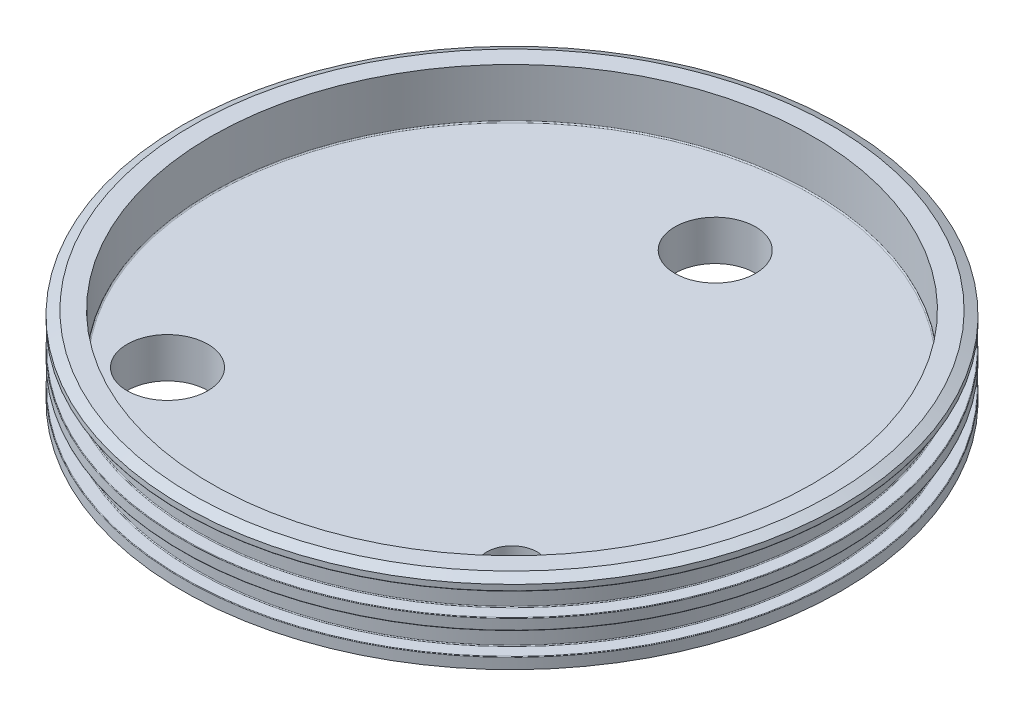
ISO-10303-21;
HEADER;
FILE_DESCRIPTION(('STEP AP214'),'2;1');
FILE_NAME('part.step','',(''),(''),'','','');
FILE_SCHEMA(('AUTOMOTIVE_DESIGN { 1 0 10303 214 1 1 1 1 }'));
ENDSEC;
DATA;
#1=APPLICATION_CONTEXT('core data for automotive mechanical design processes');
#2=APPLICATION_PROTOCOL_DEFINITION('international standard','automotive_design',2000,#1);
#3=PRODUCT_CONTEXT('',#1,'mechanical');
#4=PRODUCT('Part','Part','',(#3));
#5=PRODUCT_RELATED_PRODUCT_CATEGORY('part','',(#4));
#6=PRODUCT_DEFINITION_FORMATION('','',#4);
#7=PRODUCT_DEFINITION_CONTEXT('part definition',#1,'design');
#8=PRODUCT_DEFINITION('design','',#6,#7);
#9=PRODUCT_DEFINITION_SHAPE('','',#8);
#10=(LENGTH_UNIT() NAMED_UNIT(*) SI_UNIT(.MILLI.,.METRE.));
#11=(NAMED_UNIT(*) PLANE_ANGLE_UNIT() SI_UNIT($,.RADIAN.));
#12=(NAMED_UNIT(*) SI_UNIT($,.STERADIAN.) SOLID_ANGLE_UNIT());
#13=UNCERTAINTY_MEASURE_WITH_UNIT(LENGTH_MEASURE(1.E-05),#10,'distance_accuracy_value','');
#14=(GEOMETRIC_REPRESENTATION_CONTEXT(3) GLOBAL_UNCERTAINTY_ASSIGNED_CONTEXT((#13)) GLOBAL_UNIT_ASSIGNED_CONTEXT((#10,
#11,#12)) REPRESENTATION_CONTEXT('',''));
#15=CARTESIAN_POINT('',(0.,0.,0.));
#16=DIRECTION('',(0.,0.,1.));
#17=DIRECTION('',(1.,0.,0.));
#18=AXIS2_PLACEMENT_3D('',#15,#16,#17);
#19=CARTESIAN_POINT('',(0.,0.,0.));
#20=DIRECTION('',(0.,1.,0.));
#21=DIRECTION('',(-1.,0.,0.));
#22=AXIS2_PLACEMENT_3D('',#19,#20,#21);
#23=PLANE('',#22);
#24=CARTESIAN_POINT('',(0.,0.,0.));
#25=DIRECTION('',(0.,1.,0.));
#26=DIRECTION('',(-1.,0.,0.));
#27=AXIS2_PLACEMENT_3D('',#24,#25,#26);
#28=CIRCLE('',#27,66.2178);
#29=CARTESIAN_POINT('',(-66.2178,0.,0.));
#30=VERTEX_POINT('',#29);
#31=EDGE_CURVE('E92',#30,#30,#28,.T.);
#32=ORIENTED_EDGE('',*,*,#31,.T.);
#33=EDGE_LOOP('',(#32));
#34=FACE_BOUND('',#33,.T.);
#35=CARTESIAN_POINT('',(0.,0.,0.));
#36=DIRECTION('',(0.,1.,0.));
#37=DIRECTION('',(-1.,0.,0.));
#38=AXIS2_PLACEMENT_3D('',#35,#36,#37);
#39=CIRCLE('',#38,72.898);
#40=CARTESIAN_POINT('',(-72.898,0.,0.));
#41=VERTEX_POINT('',#40);
#42=EDGE_CURVE('E73',#41,#41,#39,.T.);
#43=ORIENTED_EDGE('',*,*,#42,.F.);
#44=EDGE_LOOP('',(#43));
#45=FACE_BOUND('',#44,.T.);
#46=ADVANCED_FACE('F45',(#34,#45),#23,.F.);
#47=CARTESIAN_POINT('',(0.,48.1922132313012,0.));
#48=DIRECTION('',(0.,1.,0.));
#49=DIRECTION('',(-1.,0.,0.));
#50=AXIS2_PLACEMENT_3D('',#47,#48,#49);
#51=CYLINDRICAL_SURFACE('',#50,72.898);
#52=CARTESIAN_POINT('',(0.,2.33679999999999,0.));
#53=DIRECTION('',(0.,-1.,0.));
#54=DIRECTION('',(1.,0.,0.));
#55=AXIS2_PLACEMENT_3D('',#52,#53,#54);
#56=CIRCLE('',#55,72.898);
#57=CARTESIAN_POINT('',(72.898,2.3368,0.));
#58=VERTEX_POINT('',#57);
#59=EDGE_CURVE('E164',#58,#58,#56,.T.);
#60=ORIENTED_EDGE('',*,*,#59,.T.);
#61=EDGE_LOOP('',(#60));
#62=FACE_BOUND('',#61,.T.);
#63=ORIENTED_EDGE('',*,*,#42,.T.);
#64=EDGE_LOOP('',(#63));
#65=FACE_BOUND('',#64,.T.);
#66=ADVANCED_FACE('F202',(#62,#65),#51,.T.);
#67=CARTESIAN_POINT('',(72.898,2.4638,0.));
#68=DIRECTION('',(0.,-1.,0.));
#69=DIRECTION('',(1.,0.,0.));
#70=AXIS2_PLACEMENT_3D('',#67,#68,#69);
#71=PLANE('',#70);
#72=CARTESIAN_POINT('',(0.,2.46379999999999,0.));
#73=DIRECTION('',(0.,-1.,0.));
#74=DIRECTION('',(1.,0.,0.));
#75=AXIS2_PLACEMENT_3D('',#72,#73,#74);
#76=CIRCLE('',#75,72.771);
#77=CARTESIAN_POINT('',(72.771,2.4638,0.));
#78=VERTEX_POINT('',#77);
#79=EDGE_CURVE('E160',#78,#78,#76,.F.);
#80=ORIENTED_EDGE('',*,*,#79,.T.);
#81=EDGE_LOOP('',(#80));
#82=FACE_BOUND('',#81,.T.);
#83=CARTESIAN_POINT('',(0.,2.46379999999999,0.));
#84=DIRECTION('',(0.,-1.,0.));
#85=DIRECTION('',(1.,0.,0.));
#86=AXIS2_PLACEMENT_3D('',#83,#84,#85);
#87=CIRCLE('',#86,70.1548);
#88=CARTESIAN_POINT('',(70.1548,2.4638,0.));
#89=VERTEX_POINT('',#88);
#90=EDGE_CURVE('E124',#89,#89,#87,.T.);
#91=ORIENTED_EDGE('',*,*,#90,.T.);
#92=EDGE_LOOP('',(#91));
#93=FACE_BOUND('',#92,.T.);
#94=ADVANCED_FACE('F209',(#82,#93),#71,.F.);
#95=CARTESIAN_POINT('',(0.,48.1922132313012,0.));
#96=DIRECTION('',(0.,1.,0.));
#97=DIRECTION('',(-1.,0.,0.));
#98=AXIS2_PLACEMENT_3D('',#95,#96,#97);
#99=CYLINDRICAL_SURFACE('',#98,69.977);
#100=CARTESIAN_POINT('',(0.,7.26439999999999,0.));
#101=DIRECTION('',(0.,1.,0.));
#102=DIRECTION('',(-1.,0.,0.));
#103=AXIS2_PLACEMENT_3D('',#100,#101,#102);
#104=CIRCLE('',#103,69.977);
#105=CARTESIAN_POINT('',(-69.977,7.26439999999998,0.));
#106=VERTEX_POINT('',#105);
#107=EDGE_CURVE('E120',#106,#106,#104,.F.);
#108=ORIENTED_EDGE('',*,*,#107,.T.);
#109=EDGE_LOOP('',(#108));
#110=FACE_BOUND('',#109,.T.);
#111=CARTESIAN_POINT('',(0.,2.64159999999999,0.));
#112=DIRECTION('',(0.,-1.,0.));
#113=DIRECTION('',(1.,0.,0.));
#114=AXIS2_PLACEMENT_3D('',#111,#112,#113);
#115=CIRCLE('',#114,69.977);
#116=CARTESIAN_POINT('',(69.977,2.6416,0.));
#117=VERTEX_POINT('',#116);
#118=EDGE_CURVE('E116',#117,#117,#115,.F.);
#119=ORIENTED_EDGE('',*,*,#118,.T.);
#120=EDGE_LOOP('',(#119));
#121=FACE_BOUND('',#120,.T.);
#122=ADVANCED_FACE('F266',(#110,#121),#99,.T.);
#123=CARTESIAN_POINT('',(69.977,7.4422,0.));
#124=DIRECTION('',(0.,1.,0.));
#125=DIRECTION('',(-1.,0.,0.));
#126=AXIS2_PLACEMENT_3D('',#123,#124,#125);
#127=PLANE('',#126);
#128=CARTESIAN_POINT('',(0.,7.44219999999999,0.));
#129=DIRECTION('',(0.,1.,0.));
#130=DIRECTION('',(-1.,0.,0.));
#131=AXIS2_PLACEMENT_3D('',#128,#129,#130);
#132=CIRCLE('',#131,72.771);
#133=CARTESIAN_POINT('',(-72.771,7.44219999999998,0.));
#134=VERTEX_POINT('',#133);
#135=EDGE_CURVE('E156',#134,#134,#132,.F.);
#136=ORIENTED_EDGE('',*,*,#135,.T.);
#137=EDGE_LOOP('',(#136));
#138=FACE_BOUND('',#137,.T.);
#139=CARTESIAN_POINT('',(0.,7.44219999999999,0.));
#140=DIRECTION('',(0.,1.,0.));
#141=DIRECTION('',(-1.,0.,0.));
#142=AXIS2_PLACEMENT_3D('',#139,#140,#141);
#143=CIRCLE('',#142,70.1548);
#144=CARTESIAN_POINT('',(-70.1548,7.44219999999998,0.));
#145=VERTEX_POINT('',#144);
#146=EDGE_CURVE('E112',#145,#145,#143,.T.);
#147=ORIENTED_EDGE('',*,*,#146,.T.);
#148=EDGE_LOOP('',(#147));
#149=FACE_BOUND('',#148,.T.);
#150=ADVANCED_FACE('F271',(#138,#149),#127,.F.);
#151=CARTESIAN_POINT('',(0.,48.1922132313012,0.));
#152=DIRECTION('',(0.,1.,0.));
#153=DIRECTION('',(-1.,0.,0.));
#154=AXIS2_PLACEMENT_3D('',#151,#152,#153);
#155=CYLINDRICAL_SURFACE('',#154,72.898);
#156=CARTESIAN_POINT('',(0.,9.77899999999999,0.));
#157=DIRECTION('',(0.,-1.,0.));
#158=DIRECTION('',(1.,0.,0.));
#159=AXIS2_PLACEMENT_3D('',#156,#157,#158);
#160=CIRCLE('',#159,72.898);
#161=CARTESIAN_POINT('',(72.898,9.779,0.));
#162=VERTEX_POINT('',#161);
#163=EDGE_CURVE('E136',#162,#162,#160,.T.);
#164=ORIENTED_EDGE('',*,*,#163,.T.);
#165=EDGE_LOOP('',(#164));
#166=FACE_BOUND('',#165,.T.);
#167=CARTESIAN_POINT('',(0.,7.56919999999999,0.));
#168=DIRECTION('',(0.,1.,0.));
#169=DIRECTION('',(-1.,0.,0.));
#170=AXIS2_PLACEMENT_3D('',#167,#168,#169);
#171=CIRCLE('',#170,72.898);
#172=CARTESIAN_POINT('',(-72.898,7.56919999999998,0.));
#173=VERTEX_POINT('',#172);
#174=EDGE_CURVE('E132',#173,#173,#171,.T.);
#175=ORIENTED_EDGE('',*,*,#174,.T.);
#176=EDGE_LOOP('',(#175));
#177=FACE_BOUND('',#176,.T.);
#178=ADVANCED_FACE('F278',(#166,#177),#155,.T.);
#179=CARTESIAN_POINT('',(72.898,9.906,0.));
#180=DIRECTION('',(0.,-1.,0.));
#181=DIRECTION('',(1.,0.,0.));
#182=AXIS2_PLACEMENT_3D('',#179,#180,#181);
#183=PLANE('',#182);
#184=CARTESIAN_POINT('',(0.,9.90599999999999,0.));
#185=DIRECTION('',(0.,-1.,0.));
#186=DIRECTION('',(1.,0.,0.));
#187=AXIS2_PLACEMENT_3D('',#184,#185,#186);
#188=CIRCLE('',#187,72.771);
#189=CARTESIAN_POINT('',(72.771,9.906,0.));
#190=VERTEX_POINT('',#189);
#191=EDGE_CURVE('E128',#190,#190,#188,.F.);
#192=ORIENTED_EDGE('',*,*,#191,.T.);
#193=EDGE_LOOP('',(#192));
#194=FACE_BOUND('',#193,.T.);
#195=CARTESIAN_POINT('',(0.,9.90599999999999,0.));
#196=DIRECTION('',(0.,-1.,0.));
#197=DIRECTION('',(1.,0.,0.));
#198=AXIS2_PLACEMENT_3D('',#195,#196,#197);
#199=CIRCLE('',#198,70.1548);
#200=CARTESIAN_POINT('',(70.1548,9.906,0.));
#201=VERTEX_POINT('',#200);
#202=EDGE_CURVE('E108',#201,#201,#199,.T.);
#203=ORIENTED_EDGE('',*,*,#202,.T.);
#204=EDGE_LOOP('',(#203));
#205=FACE_BOUND('',#204,.T.);
#206=ADVANCED_FACE('F284',(#194,#205),#183,.F.);
#207=CARTESIAN_POINT('',(0.,48.1922132313012,0.));
#208=DIRECTION('',(0.,1.,0.));
#209=DIRECTION('',(-1.,0.,0.));
#210=AXIS2_PLACEMENT_3D('',#207,#208,#209);
#211=CYLINDRICAL_SURFACE('',#210,69.977);
#212=CARTESIAN_POINT('',(0.,14.8082,0.));
#213=DIRECTION('',(0.,1.,0.));
#214=DIRECTION('',(-1.,0.,0.));
#215=AXIS2_PLACEMENT_3D('',#212,#213,#214);
#216=CIRCLE('',#215,69.977);
#217=CARTESIAN_POINT('',(-69.977,14.8082,0.));
#218=VERTEX_POINT('',#217);
#219=EDGE_CURVE('E104',#218,#218,#216,.F.);
#220=ORIENTED_EDGE('',*,*,#219,.T.);
#221=EDGE_LOOP('',(#220));
#222=FACE_BOUND('',#221,.T.);
#223=CARTESIAN_POINT('',(0.,10.0838,0.));
#224=DIRECTION('',(0.,-1.,0.));
#225=DIRECTION('',(1.,0.,0.));
#226=AXIS2_PLACEMENT_3D('',#223,#224,#225);
#227=CIRCLE('',#226,69.977);
#228=CARTESIAN_POINT('',(69.977,10.0838,0.));
#229=VERTEX_POINT('',#228);
#230=EDGE_CURVE('E100',#229,#229,#227,.F.);
#231=ORIENTED_EDGE('',*,*,#230,.T.);
#232=EDGE_LOOP('',(#231));
#233=FACE_BOUND('',#232,.T.);
#234=ADVANCED_FACE('F288',(#222,#233),#211,.T.);
#235=CARTESIAN_POINT('',(69.977,14.986,0.));
#236=DIRECTION('',(0.,1.,0.));
#237=DIRECTION('',(-1.,0.,0.));
#238=AXIS2_PLACEMENT_3D('',#235,#236,#237);
#239=PLANE('',#238);
#240=CARTESIAN_POINT('',(0.,14.986,0.));
#241=DIRECTION('',(0.,1.,0.));
#242=DIRECTION('',(-1.,0.,0.));
#243=AXIS2_PLACEMENT_3D('',#240,#241,#242);
#244=CIRCLE('',#243,72.771);
#245=CARTESIAN_POINT('',(-72.771,14.986,0.));
#246=VERTEX_POINT('',#245);
#247=EDGE_CURVE('E144',#246,#246,#244,.F.);
#248=ORIENTED_EDGE('',*,*,#247,.T.);
#249=EDGE_LOOP('',(#248));
#250=FACE_BOUND('',#249,.T.);
#251=CARTESIAN_POINT('',(0.,14.986,0.));
#252=DIRECTION('',(0.,1.,0.));
#253=DIRECTION('',(-1.,0.,0.));
#254=AXIS2_PLACEMENT_3D('',#251,#252,#253);
#255=CIRCLE('',#254,70.1548);
#256=CARTESIAN_POINT('',(-70.1548,14.986,0.));
#257=VERTEX_POINT('',#256);
#258=EDGE_CURVE('E96',#257,#257,#255,.T.);
#259=ORIENTED_EDGE('',*,*,#258,.T.);
#260=EDGE_LOOP('',(#259));
#261=FACE_BOUND('',#260,.T.);
#262=ADVANCED_FACE('F291',(#250,#261),#239,.F.);
#263=CARTESIAN_POINT('',(0.,48.1922132313012,0.));
#264=DIRECTION('',(0.,1.,0.));
#265=DIRECTION('',(-1.,0.,0.));
#266=AXIS2_PLACEMENT_3D('',#263,#264,#265);
#267=CYLINDRICAL_SURFACE('',#266,72.898);
#268=CARTESIAN_POINT('',(0.,16.3322,0.));
#269=DIRECTION('',(0.,-1.,0.));
#270=DIRECTION('',(1.,0.,0.));
#271=AXIS2_PLACEMENT_3D('',#268,#269,#270);
#272=CIRCLE('',#271,72.898);
#273=CARTESIAN_POINT('',(72.898,16.3322,0.));
#274=VERTEX_POINT('',#273);
#275=EDGE_CURVE('E60',#274,#274,#272,.T.);
#276=ORIENTED_EDGE('',*,*,#275,.T.);
#277=EDGE_LOOP('',(#276));
#278=FACE_BOUND('',#277,.T.);
#279=CARTESIAN_POINT('',(0.,15.113,0.));
#280=DIRECTION('',(0.,1.,0.));
#281=DIRECTION('',(-1.,0.,0.));
#282=AXIS2_PLACEMENT_3D('',#279,#280,#281);
#283=CIRCLE('',#282,72.898);
#284=CARTESIAN_POINT('',(-72.898,15.113,0.));
#285=VERTEX_POINT('',#284);
#286=EDGE_CURVE('E140',#285,#285,#283,.T.);
#287=ORIENTED_EDGE('',*,*,#286,.T.);
#288=EDGE_LOOP('',(#287));
#289=FACE_BOUND('',#288,.T.);
#290=ADVANCED_FACE('F175',(#278,#289),#267,.T.);
#291=CARTESIAN_POINT('',(72.898,17.3482,0.));
#292=DIRECTION('',(0.,-1.,0.));
#293=DIRECTION('',(1.,0.,0.));
#294=AXIS2_PLACEMENT_3D('',#291,#292,#293);
#295=PLANE('',#294);
#296=CARTESIAN_POINT('',(0.,17.3482,0.));
#297=DIRECTION('',(0.,-1.,0.));
#298=DIRECTION('',(1.,0.,0.));
#299=AXIS2_PLACEMENT_3D('',#296,#297,#298);
#300=CIRCLE('',#299,70.7191809687623);
#301=CARTESIAN_POINT('',(70.7191809687623,17.3482,0.));
#302=VERTEX_POINT('',#301);
#303=EDGE_CURVE('E168',#302,#302,#300,.F.);
#304=ORIENTED_EDGE('',*,*,#303,.T.);
#305=EDGE_LOOP('',(#304));
#306=FACE_BOUND('',#305,.T.);
#307=CARTESIAN_POINT('',(0.,17.3482,0.));
#308=DIRECTION('',(0.,1.,0.));
#309=DIRECTION('',(-1.,0.,0.));
#310=AXIS2_PLACEMENT_3D('',#307,#308,#309);
#311=CIRCLE('',#310,66.548);
#312=CARTESIAN_POINT('',(-66.548,17.3482,0.));
#313=VERTEX_POINT('',#312);
#314=EDGE_CURVE('E66',#313,#313,#311,.T.);
#315=ORIENTED_EDGE('',*,*,#314,.F.);
#316=EDGE_LOOP('',(#315));
#317=FACE_BOUND('',#316,.T.);
#318=ADVANCED_FACE('F184',(#306,#317),#295,.F.);
#319=CARTESIAN_POINT('',(0.,48.1922132313012,0.));
#320=DIRECTION('',(0.,1.,0.));
#321=DIRECTION('',(-1.,0.,0.));
#322=AXIS2_PLACEMENT_3D('',#319,#320,#321);
#323=CYLINDRICAL_SURFACE('',#322,66.548);
#324=CARTESIAN_POINT('',(0.,6.604,0.));
#325=DIRECTION('',(0.,-1.,0.));
#326=DIRECTION('',(1.,0.,0.));
#327=AXIS2_PLACEMENT_3D('',#324,#325,#326);
#328=CIRCLE('',#327,66.548);
#329=CARTESIAN_POINT('',(66.548,6.60400000000001,0.));
#330=VERTEX_POINT('',#329);
#331=EDGE_CURVE('E10',#330,#330,#328,.T.);
#332=ORIENTED_EDGE('',*,*,#331,.T.);
#333=EDGE_LOOP('',(#332));
#334=FACE_BOUND('',#333,.T.);
#335=ORIENTED_EDGE('',*,*,#314,.T.);
#336=EDGE_LOOP('',(#335));
#337=FACE_BOUND('',#336,.T.);
#338=ADVANCED_FACE('F187',(#334,#337),#323,.F.);
#339=CARTESIAN_POINT('',(66.548,6.35,0.));
#340=DIRECTION('',(0.,-1.,0.));
#341=DIRECTION('',(1.,0.,0.));
#342=AXIS2_PLACEMENT_3D('',#339,#340,#341);
#343=PLANE('',#342);
#344=CARTESIAN_POINT('',(-38.1,6.34999999999999,38.1));
#345=DIRECTION('',(0.,-1.,0.));
#346=DIRECTION('',(1.,0.,0.));
#347=AXIS2_PLACEMENT_3D('',#344,#345,#346);
#348=CIRCLE('',#347,8.9281);
#349=CARTESIAN_POINT('',(-29.1719,6.34999999999999,38.1));
#350=VERTEX_POINT('',#349);
#351=EDGE_CURVE('E501',#350,#350,#348,.T.);
#352=ORIENTED_EDGE('',*,*,#351,.T.);
#353=EDGE_LOOP('',(#352));
#354=FACE_BOUND('',#353,.T.);
#355=CARTESIAN_POINT('',(38.1,6.35,38.1));
#356=DIRECTION('',(0.,-1.,0.));
#357=DIRECTION('',(1.,0.,0.));
#358=AXIS2_PLACEMENT_3D('',#355,#356,#357);
#359=CIRCLE('',#358,5.56259999999999);
#360=CARTESIAN_POINT('',(43.6626,6.35,38.1));
#361=VERTEX_POINT('',#360);
#362=EDGE_CURVE('E49',#361,#361,#359,.T.);
#363=ORIENTED_EDGE('',*,*,#362,.T.);
#364=EDGE_LOOP('',(#363));
#365=FACE_BOUND('',#364,.T.);
#366=CARTESIAN_POINT('',(0.,6.34999999999999,-44.958));
#367=DIRECTION('',(0.,-1.,0.));
#368=DIRECTION('',(1.,0.,0.));
#369=AXIS2_PLACEMENT_3D('',#366,#367,#368);
#370=CIRCLE('',#369,8.9281);
#371=CARTESIAN_POINT('',(8.9281,6.35,-44.958));
#372=VERTEX_POINT('',#371);
#373=EDGE_CURVE('E63',#372,#372,#370,.T.);
#374=ORIENTED_EDGE('',*,*,#373,.T.);
#375=EDGE_LOOP('',(#374));
#376=FACE_BOUND('',#375,.T.);
#377=CARTESIAN_POINT('',(0.,6.35,0.));
#378=DIRECTION('',(0.,-1.,0.));
#379=DIRECTION('',(1.,0.,0.));
#380=AXIS2_PLACEMENT_3D('',#377,#378,#379);
#381=CIRCLE('',#380,66.294);
#382=CARTESIAN_POINT('',(66.294,6.35,0.));
#383=VERTEX_POINT('',#382);
#384=EDGE_CURVE('E54',#383,#383,#381,.F.);
#385=ORIENTED_EDGE('',*,*,#384,.T.);
#386=EDGE_LOOP('',(#385));
#387=FACE_BOUND('',#386,.T.);
#388=ADVANCED_FACE('F192',(#354,#365,#376,#387),#343,.F.);
#389=CARTESIAN_POINT('',(0.,-2.54,0.));
#390=DIRECTION('',(0.,1.,0.));
#391=DIRECTION('',(-1.,0.,0.));
#392=AXIS2_PLACEMENT_3D('',#389,#390,#391);
#393=CYLINDRICAL_SURFACE('',#392,66.04);
#394=CARTESIAN_POINT('',(0.,-2.413,0.));
#395=DIRECTION('',(0.,-1.,0.));
#396=DIRECTION('',(1.,0.,0.));
#397=AXIS2_PLACEMENT_3D('',#394,#395,#396);
#398=CIRCLE('',#397,66.04);
#399=CARTESIAN_POINT('',(66.04,-2.41299999999999,0.));
#400=VERTEX_POINT('',#399);
#401=EDGE_CURVE('E152',#400,#400,#398,.F.);
#402=ORIENTED_EDGE('',*,*,#401,.T.);
#403=EDGE_LOOP('',(#402));
#404=FACE_BOUND('',#403,.T.);
#405=CARTESIAN_POINT('',(0.,-0.177800000000004,0.));
#406=DIRECTION('',(0.,1.,0.));
#407=DIRECTION('',(-1.,0.,0.));
#408=AXIS2_PLACEMENT_3D('',#405,#406,#407);
#409=CIRCLE('',#408,66.04);
#410=CARTESIAN_POINT('',(-66.04,-0.177800000000012,0.));
#411=VERTEX_POINT('',#410);
#412=EDGE_CURVE('E88',#411,#411,#409,.F.);
#413=ORIENTED_EDGE('',*,*,#412,.T.);
#414=EDGE_LOOP('',(#413));
#415=FACE_BOUND('',#414,.T.);
#416=ADVANCED_FACE('F198',(#404,#415),#393,.T.);
#417=CARTESIAN_POINT('',(0.,-2.54,0.));
#418=DIRECTION('',(0.,-1.,0.));
#419=DIRECTION('',(1.,0.,0.));
#420=AXIS2_PLACEMENT_3D('',#417,#418,#419);
#421=PLANE('',#420);
#422=CARTESIAN_POINT('',(-38.1,-2.54000000000001,38.1));
#423=DIRECTION('',(0.,-1.,0.));
#424=DIRECTION('',(0.,0.,-1.));
#425=AXIS2_PLACEMENT_3D('',#422,#423,#424);
#426=CIRCLE('',#425,8.9281);
#427=CARTESIAN_POINT('',(-38.1,-2.54000000000001,29.1719));
#428=VERTEX_POINT('',#427);
#429=EDGE_CURVE('E496',#428,#428,#426,.T.);
#430=ORIENTED_EDGE('',*,*,#429,.F.);
#431=EDGE_LOOP('',(#430));
#432=FACE_BOUND('',#431,.T.);
#433=CARTESIAN_POINT('',(38.1,-2.54,38.1));
#434=DIRECTION('',(0.,-1.,0.));
#435=DIRECTION('',(0.,0.,-1.));
#436=AXIS2_PLACEMENT_3D('',#433,#434,#435);
#437=CIRCLE('',#436,5.56259999999999);
#438=CARTESIAN_POINT('',(38.1,-2.54,32.5374));
#439=VERTEX_POINT('',#438);
#440=EDGE_CURVE('E81',#439,#439,#437,.T.);
#441=ORIENTED_EDGE('',*,*,#440,.F.);
#442=EDGE_LOOP('',(#441));
#443=FACE_BOUND('',#442,.T.);
#444=CARTESIAN_POINT('',(0.,-2.54,-44.958));
#445=DIRECTION('',(0.,-1.,0.));
#446=DIRECTION('',(0.,0.,-1.));
#447=AXIS2_PLACEMENT_3D('',#444,#445,#446);
#448=CIRCLE('',#447,8.9281);
#449=CARTESIAN_POINT('',(0.,-2.54,-53.8861));
#450=VERTEX_POINT('',#449);
#451=EDGE_CURVE('E67',#450,#450,#448,.T.);
#452=ORIENTED_EDGE('',*,*,#451,.F.);
#453=EDGE_LOOP('',(#452));
#454=FACE_BOUND('',#453,.T.);
#455=CARTESIAN_POINT('',(0.,-2.54,0.));
#456=DIRECTION('',(0.,-1.,0.));
#457=DIRECTION('',(1.,0.,0.));
#458=AXIS2_PLACEMENT_3D('',#455,#456,#457);
#459=CIRCLE('',#458,65.913);
#460=CARTESIAN_POINT('',(65.913,-2.53999999999999,0.));
#461=VERTEX_POINT('',#460);
#462=EDGE_CURVE('E148',#461,#461,#459,.T.);
#463=ORIENTED_EDGE('',*,*,#462,.T.);
#464=EDGE_LOOP('',(#463));
#465=FACE_BOUND('',#464,.T.);
#466=ADVANCED_FACE('F219',(#432,#443,#454,#465),#421,.T.);
#467=CARTESIAN_POINT('',(0.,-0.177800000000004,0.));
#468=DIRECTION('',(0.,1.,0.));
#469=DIRECTION('',(-1.,0.,0.));
#470=AXIS2_PLACEMENT_3D('',#467,#468,#469);
#471=TOROIDAL_SURFACE('',#470,66.2178,0.1778);
#472=ORIENTED_EDGE('',*,*,#31,.F.);
#473=EDGE_LOOP('',(#472));
#474=FACE_BOUND('',#473,.T.);
#475=ORIENTED_EDGE('',*,*,#412,.F.);
#476=EDGE_LOOP('',(#475));
#477=FACE_BOUND('',#476,.T.);
#478=ADVANCED_FACE('F215',(#474,#477),#471,.F.);
#479=CARTESIAN_POINT('',(0.,14.8082,0.));
#480=DIRECTION('',(0.,1.,0.));
#481=DIRECTION('',(-1.,0.,0.));
#482=AXIS2_PLACEMENT_3D('',#479,#480,#481);
#483=TOROIDAL_SURFACE('',#482,70.1548,0.1778);
#484=ORIENTED_EDGE('',*,*,#219,.F.);
#485=EDGE_LOOP('',(#484));
#486=FACE_BOUND('',#485,.T.);
#487=ORIENTED_EDGE('',*,*,#258,.F.);
#488=EDGE_LOOP('',(#487));
#489=FACE_BOUND('',#488,.T.);
#490=ADVANCED_FACE('F218',(#486,#489),#483,.F.);
#491=CARTESIAN_POINT('',(0.,10.0838,0.));
#492=DIRECTION('',(0.,-1.,0.));
#493=DIRECTION('',(1.,0.,0.));
#494=AXIS2_PLACEMENT_3D('',#491,#492,#493);
#495=TOROIDAL_SURFACE('',#494,70.1548,0.1778);
#496=ORIENTED_EDGE('',*,*,#202,.F.);
#497=EDGE_LOOP('',(#496));
#498=FACE_BOUND('',#497,.T.);
#499=ORIENTED_EDGE('',*,*,#230,.F.);
#500=EDGE_LOOP('',(#499));
#501=FACE_BOUND('',#500,.T.);
#502=ADVANCED_FACE('F223',(#498,#501),#495,.F.);
#503=CARTESIAN_POINT('',(0.,7.26439999999999,0.));
#504=DIRECTION('',(0.,1.,0.));
#505=DIRECTION('',(-1.,0.,0.));
#506=AXIS2_PLACEMENT_3D('',#503,#504,#505);
#507=TOROIDAL_SURFACE('',#506,70.1548,0.1778);
#508=ORIENTED_EDGE('',*,*,#107,.F.);
#509=EDGE_LOOP('',(#508));
#510=FACE_BOUND('',#509,.T.);
#511=ORIENTED_EDGE('',*,*,#146,.F.);
#512=EDGE_LOOP('',(#511));
#513=FACE_BOUND('',#512,.T.);
#514=ADVANCED_FACE('F227',(#510,#513),#507,.F.);
#515=CARTESIAN_POINT('',(0.,2.64159999999999,0.));
#516=DIRECTION('',(0.,-1.,0.));
#517=DIRECTION('',(1.,0.,0.));
#518=AXIS2_PLACEMENT_3D('',#515,#516,#517);
#519=TOROIDAL_SURFACE('',#518,70.1548,0.1778);
#520=ORIENTED_EDGE('',*,*,#90,.F.);
#521=EDGE_LOOP('',(#520));
#522=FACE_BOUND('',#521,.T.);
#523=ORIENTED_EDGE('',*,*,#118,.F.);
#524=EDGE_LOOP('',(#523));
#525=FACE_BOUND('',#524,.T.);
#526=ADVANCED_FACE('F231',(#522,#525),#519,.F.);
#527=CARTESIAN_POINT('',(0.,9.77899999999999,0.));
#528=DIRECTION('',(0.,-1.,0.));
#529=DIRECTION('',(1.,0.,0.));
#530=AXIS2_PLACEMENT_3D('',#527,#528,#529);
#531=TOROIDAL_SURFACE('',#530,72.771,0.127);
#532=ORIENTED_EDGE('',*,*,#163,.F.);
#533=EDGE_LOOP('',(#532));
#534=FACE_BOUND('',#533,.T.);
#535=ORIENTED_EDGE('',*,*,#191,.F.);
#536=EDGE_LOOP('',(#535));
#537=FACE_BOUND('',#536,.T.);
#538=ADVANCED_FACE('F235',(#534,#537),#531,.T.);
#539=CARTESIAN_POINT('',(0.,15.113,0.));
#540=DIRECTION('',(0.,1.,0.));
#541=DIRECTION('',(-1.,0.,0.));
#542=AXIS2_PLACEMENT_3D('',#539,#540,#541);
#543=TOROIDAL_SURFACE('',#542,72.771,0.127);
#544=ORIENTED_EDGE('',*,*,#247,.F.);
#545=EDGE_LOOP('',(#544));
#546=FACE_BOUND('',#545,.T.);
#547=ORIENTED_EDGE('',*,*,#286,.F.);
#548=EDGE_LOOP('',(#547));
#549=FACE_BOUND('',#548,.T.);
#550=ADVANCED_FACE('F239',(#546,#549),#543,.T.);
#551=CARTESIAN_POINT('',(0.,-2.413,0.));
#552=DIRECTION('',(0.,-1.,0.));
#553=DIRECTION('',(1.,0.,0.));
#554=AXIS2_PLACEMENT_3D('',#551,#552,#553);
#555=TOROIDAL_SURFACE('',#554,65.913,0.127);
#556=ORIENTED_EDGE('',*,*,#401,.F.);
#557=EDGE_LOOP('',(#556));
#558=FACE_BOUND('',#557,.T.);
#559=ORIENTED_EDGE('',*,*,#462,.F.);
#560=EDGE_LOOP('',(#559));
#561=FACE_BOUND('',#560,.T.);
#562=ADVANCED_FACE('F243',(#558,#561),#555,.T.);
#563=CARTESIAN_POINT('',(0.,7.56919999999999,0.));
#564=DIRECTION('',(0.,1.,0.));
#565=DIRECTION('',(-1.,0.,0.));
#566=AXIS2_PLACEMENT_3D('',#563,#564,#565);
#567=TOROIDAL_SURFACE('',#566,72.771,0.127);
#568=ORIENTED_EDGE('',*,*,#135,.F.);
#569=EDGE_LOOP('',(#568));
#570=FACE_BOUND('',#569,.T.);
#571=ORIENTED_EDGE('',*,*,#174,.F.);
#572=EDGE_LOOP('',(#571));
#573=FACE_BOUND('',#572,.T.);
#574=ADVANCED_FACE('F247',(#570,#573),#567,.T.);
#575=CARTESIAN_POINT('',(0.,2.33679999999999,0.));
#576=DIRECTION('',(0.,-1.,0.));
#577=DIRECTION('',(1.,0.,0.));
#578=AXIS2_PLACEMENT_3D('',#575,#576,#577);
#579=TOROIDAL_SURFACE('',#578,72.771,0.127);
#580=ORIENTED_EDGE('',*,*,#59,.F.);
#581=EDGE_LOOP('',(#580));
#582=FACE_BOUND('',#581,.T.);
#583=ORIENTED_EDGE('',*,*,#79,.F.);
#584=EDGE_LOOP('',(#583));
#585=FACE_BOUND('',#584,.T.);
#586=ADVANCED_FACE('F181',(#582,#585),#579,.T.);
#587=CARTESIAN_POINT('',(0.,17.3482,0.));
#588=DIRECTION('',(0.,-1.,0.));
#589=DIRECTION('',(1.,0.,0.));
#590=AXIS2_PLACEMENT_3D('',#587,#588,#589);
#591=CONICAL_SURFACE('',#590,70.7191809687623,1.13446401379632);
#592=ORIENTED_EDGE('',*,*,#275,.F.);
#593=EDGE_LOOP('',(#592));
#594=FACE_BOUND('',#593,.T.);
#595=ORIENTED_EDGE('',*,*,#303,.F.);
#596=EDGE_LOOP('',(#595));
#597=FACE_BOUND('',#596,.T.);
#598=ADVANCED_FACE('F178',(#594,#597),#591,.T.);
#599=CARTESIAN_POINT('',(0.,6.604,0.));
#600=DIRECTION('',(0.,-1.,0.));
#601=DIRECTION('',(1.,0.,0.));
#602=AXIS2_PLACEMENT_3D('',#599,#600,#601);
#603=TOROIDAL_SURFACE('',#602,66.294,0.254);
#604=ORIENTED_EDGE('',*,*,#331,.F.);
#605=EDGE_LOOP('',(#604));
#606=FACE_BOUND('',#605,.T.);
#607=ORIENTED_EDGE('',*,*,#384,.F.);
#608=EDGE_LOOP('',(#607));
#609=FACE_BOUND('',#608,.T.);
#610=ADVANCED_FACE('F47',(#606,#609),#603,.F.);
#611=CARTESIAN_POINT('',(0.,-2.54,-44.958));
#612=DIRECTION('',(0.,-1.,0.));
#613=DIRECTION('',(0.,0.,-1.));
#614=AXIS2_PLACEMENT_3D('',#611,#612,#613);
#615=CYLINDRICAL_SURFACE('',#614,8.9281);
#616=ORIENTED_EDGE('',*,*,#451,.T.);
#617=EDGE_LOOP('',(#616));
#618=FACE_BOUND('',#617,.T.);
#619=ORIENTED_EDGE('',*,*,#373,.F.);
#620=EDGE_LOOP('',(#619));
#621=FACE_BOUND('',#620,.T.);
#622=ADVANCED_FACE('F322',(#618,#621),#615,.F.);
#623=CARTESIAN_POINT('',(38.1,-2.54,38.1));
#624=DIRECTION('',(0.,-1.,0.));
#625=DIRECTION('',(0.,0.,-1.));
#626=AXIS2_PLACEMENT_3D('',#623,#624,#625);
#627=CYLINDRICAL_SURFACE('',#626,5.56259999999999);
#628=ORIENTED_EDGE('',*,*,#440,.T.);
#629=EDGE_LOOP('',(#628));
#630=FACE_BOUND('',#629,.T.);
#631=ORIENTED_EDGE('',*,*,#362,.F.);
#632=EDGE_LOOP('',(#631));
#633=FACE_BOUND('',#632,.T.);
#634=ADVANCED_FACE('F331',(#630,#633),#627,.F.);
#635=CARTESIAN_POINT('',(-38.1,-2.54,38.1));
#636=DIRECTION('',(0.,-1.,0.));
#637=DIRECTION('',(0.,0.,-1.));
#638=AXIS2_PLACEMENT_3D('',#635,#636,#637);
#639=CYLINDRICAL_SURFACE('',#638,8.9281);
#640=ORIENTED_EDGE('',*,*,#429,.T.);
#641=EDGE_LOOP('',(#640));
#642=FACE_BOUND('',#641,.T.);
#643=ORIENTED_EDGE('',*,*,#351,.F.);
#644=EDGE_LOOP('',(#643));
#645=FACE_BOUND('',#644,.T.);
#646=ADVANCED_FACE('F340',(#642,#645),#639,.F.);
#647=CLOSED_SHELL('',(#46,#66,#94,#122,#150,#178,#206,#234,#262,#290,#318,#338,#388,#416,#466,
#478,#490,#502,#514,#526,#538,#550,#562,#574,#586,#598,#610,#622,#634,#646));
#648=MANIFOLD_SOLID_BREP('B2',#647);
#649=ADVANCED_BREP_SHAPE_REPRESENTATION('',(#18,#648),#14);
#650=SHAPE_DEFINITION_REPRESENTATION(#9,#649);
ENDSEC;
END-ISO-10303-21;
